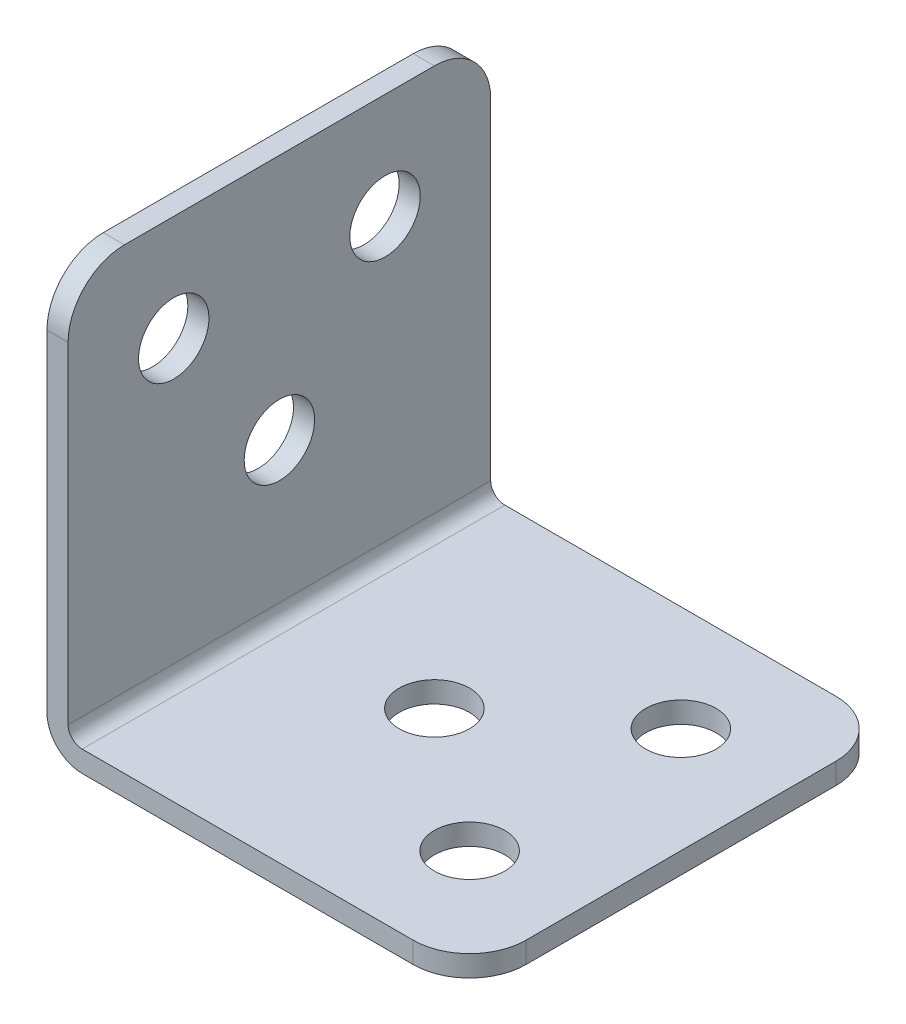
ISO-10303-21;
HEADER;
FILE_DESCRIPTION(('STEP AP214'),'2;1');
FILE_NAME('part.step','',(''),(''),'','','');
FILE_SCHEMA(('AUTOMOTIVE_DESIGN { 1 0 10303 214 1 1 1 1 }'));
ENDSEC;
DATA;
#1=APPLICATION_CONTEXT('core data for automotive mechanical design processes');
#2=APPLICATION_PROTOCOL_DEFINITION('international standard','automotive_design',2000,#1);
#3=PRODUCT_CONTEXT('',#1,'mechanical');
#4=PRODUCT('Part','Part','',(#3));
#5=PRODUCT_RELATED_PRODUCT_CATEGORY('part','',(#4));
#6=PRODUCT_DEFINITION_FORMATION('','',#4);
#7=PRODUCT_DEFINITION_CONTEXT('part definition',#1,'design');
#8=PRODUCT_DEFINITION('design','',#6,#7);
#9=PRODUCT_DEFINITION_SHAPE('','',#8);
#10=(LENGTH_UNIT() NAMED_UNIT(*) SI_UNIT(.MILLI.,.METRE.));
#11=(NAMED_UNIT(*) PLANE_ANGLE_UNIT() SI_UNIT($,.RADIAN.));
#12=(NAMED_UNIT(*) SI_UNIT($,.STERADIAN.) SOLID_ANGLE_UNIT());
#13=UNCERTAINTY_MEASURE_WITH_UNIT(LENGTH_MEASURE(1.E-05),#10,'distance_accuracy_value','');
#14=(GEOMETRIC_REPRESENTATION_CONTEXT(3) GLOBAL_UNCERTAINTY_ASSIGNED_CONTEXT((#13)) GLOBAL_UNIT_ASSIGNED_CONTEXT((#10,
#11,#12)) REPRESENTATION_CONTEXT('',''));
#15=CARTESIAN_POINT('',(0.,0.,0.));
#16=DIRECTION('',(0.,0.,1.));
#17=DIRECTION('',(1.,0.,0.));
#18=AXIS2_PLACEMENT_3D('',#15,#16,#17);
#19=CARTESIAN_POINT('',(-2.5,27.5,30.));
#20=DIRECTION('',(0.,-1.,0.));
#21=DIRECTION('',(0.,0.,-1.));
#22=AXIS2_PLACEMENT_3D('',#19,#20,#21);
#23=PLANE('',#22);
#24=DIRECTION('',(0.,0.,-1.));
#25=VECTOR('',#24,1.);
#26=CARTESIAN_POINT('',(-2.5,27.5,30.));
#27=LINE('',#26,#25);
#28=CARTESIAN_POINT('',(-2.5,27.5,26.));
#29=VERTEX_POINT('',#28);
#30=CARTESIAN_POINT('',(-2.5,27.5,4.));
#31=VERTEX_POINT('',#30);
#32=EDGE_CURVE('E144',#29,#31,#27,.T.);
#33=ORIENTED_EDGE('',*,*,#32,.F.);
#34=DIRECTION('',(-1.,0.,0.));
#35=VECTOR('',#34,1.);
#36=CARTESIAN_POINT('',(-1.,27.5,26.));
#37=LINE('',#36,#35);
#38=CARTESIAN_POINT('',(-1.,27.5,26.));
#39=VERTEX_POINT('',#38);
#40=EDGE_CURVE('E56',#29,#39,#37,.F.);
#41=ORIENTED_EDGE('',*,*,#40,.T.);
#42=DIRECTION('',(0.,0.,-1.));
#43=VECTOR('',#42,1.);
#44=CARTESIAN_POINT('',(-1.,27.5,30.));
#45=LINE('',#44,#43);
#46=CARTESIAN_POINT('',(-1.,27.5,4.));
#47=VERTEX_POINT('',#46);
#48=EDGE_CURVE('E161',#39,#47,#45,.T.);
#49=ORIENTED_EDGE('',*,*,#48,.T.);
#50=DIRECTION('',(-1.,0.,0.));
#51=VECTOR('',#50,1.);
#52=CARTESIAN_POINT('',(-2.5,27.5,4.));
#53=LINE('',#52,#51);
#54=EDGE_CURVE('E237',#47,#31,#53,.T.);
#55=ORIENTED_EDGE('',*,*,#54,.T.);
#56=EDGE_LOOP('',(#33,#41,#49,#55));
#57=FACE_BOUND('',#56,.T.);
#58=ADVANCED_FACE('F35',(#57),#23,.F.);
#59=CARTESIAN_POINT('',(-2.5,27.5,30.));
#60=DIRECTION('',(1.,0.,0.));
#61=DIRECTION('',(0.,1.,0.));
#62=AXIS2_PLACEMENT_3D('',#59,#60,#61);
#63=PLANE('',#62);
#64=CARTESIAN_POINT('',(-2.5,10.,15.));
#65=DIRECTION('',(-1.,0.,0.));
#66=DIRECTION('',(0.,-1.,0.));
#67=AXIS2_PLACEMENT_3D('',#64,#65,#66);
#68=CIRCLE('',#67,2.5);
#69=CARTESIAN_POINT('',(-2.5,7.5,15.));
#70=VERTEX_POINT('',#69);
#71=EDGE_CURVE('E198',#70,#70,#68,.T.);
#72=ORIENTED_EDGE('',*,*,#71,.F.);
#73=EDGE_LOOP('',(#72));
#74=FACE_BOUND('',#73,.T.);
#75=CARTESIAN_POINT('',(-2.5,20.,22.5));
#76=DIRECTION('',(-1.,0.,0.));
#77=DIRECTION('',(0.,1.,0.));
#78=AXIS2_PLACEMENT_3D('',#75,#76,#77);
#79=CIRCLE('',#78,2.50000000000001);
#80=CARTESIAN_POINT('',(-2.5,22.5,22.5));
#81=VERTEX_POINT('',#80);
#82=EDGE_CURVE('E204',#81,#81,#79,.T.);
#83=ORIENTED_EDGE('',*,*,#82,.F.);
#84=EDGE_LOOP('',(#83));
#85=FACE_BOUND('',#84,.T.);
#86=CARTESIAN_POINT('',(-2.5,20.,7.5));
#87=DIRECTION('',(-1.,0.,0.));
#88=DIRECTION('',(0.,-1.,0.));
#89=AXIS2_PLACEMENT_3D('',#86,#87,#88);
#90=CIRCLE('',#89,2.5);
#91=CARTESIAN_POINT('',(-2.5,17.5,7.5));
#92=VERTEX_POINT('',#91);
#93=EDGE_CURVE('E193',#92,#92,#90,.T.);
#94=ORIENTED_EDGE('',*,*,#93,.F.);
#95=EDGE_LOOP('',(#94));
#96=FACE_BOUND('',#95,.T.);
#97=DIRECTION('',(0.,-1.,0.));
#98=VECTOR('',#97,1.);
#99=CARTESIAN_POINT('',(-2.5,27.5,30.));
#100=LINE('',#99,#98);
#101=CARTESIAN_POINT('',(-2.5,23.5,30.));
#102=VERTEX_POINT('',#101);
#103=CARTESIAN_POINT('',(-2.5,0.,30.));
#104=VERTEX_POINT('',#103);
#105=EDGE_CURVE('E124',#102,#104,#100,.T.);
#106=ORIENTED_EDGE('',*,*,#105,.F.);
#107=CARTESIAN_POINT('',(-2.5,23.5,26.));
#108=DIRECTION('',(1.,0.,0.));
#109=DIRECTION('',(0.,1.,0.));
#110=AXIS2_PLACEMENT_3D('',#107,#108,#109);
#111=CIRCLE('',#110,4.);
#112=EDGE_CURVE('E235',#102,#29,#111,.F.);
#113=ORIENTED_EDGE('',*,*,#112,.T.);
#114=ORIENTED_EDGE('',*,*,#32,.T.);
#115=CARTESIAN_POINT('',(-2.5,23.5,4.));
#116=DIRECTION('',(1.,0.,0.));
#117=DIRECTION('',(0.,1.,0.));
#118=AXIS2_PLACEMENT_3D('',#115,#116,#117);
#119=CIRCLE('',#118,4.);
#120=CARTESIAN_POINT('',(-2.5,23.5,0.));
#121=VERTEX_POINT('',#120);
#122=EDGE_CURVE('E233',#31,#121,#119,.F.);
#123=ORIENTED_EDGE('',*,*,#122,.T.);
#124=DIRECTION('',(0.,-1.,0.));
#125=VECTOR('',#124,1.);
#126=CARTESIAN_POINT('',(-2.5,27.5,0.));
#127=LINE('',#126,#125);
#128=CARTESIAN_POINT('',(-2.5,0.,0.));
#129=VERTEX_POINT('',#128);
#130=EDGE_CURVE('E141',#121,#129,#127,.T.);
#131=ORIENTED_EDGE('',*,*,#130,.T.);
#132=DIRECTION('',(0.,0.,-1.));
#133=VECTOR('',#132,1.);
#134=CARTESIAN_POINT('',(-2.5,0.,30.));
#135=LINE('',#134,#133);
#136=EDGE_CURVE('E138',#104,#129,#135,.T.);
#137=ORIENTED_EDGE('',*,*,#136,.F.);
#138=EDGE_LOOP('',(#106,#113,#114,#123,#131,#137));
#139=FACE_BOUND('',#138,.T.);
#140=ADVANCED_FACE('F139',(#74,#85,#96,#139),#63,.F.);
#141=CARTESIAN_POINT('',(0.,0.,30.));
#142=DIRECTION('',(0.,0.,-1.));
#143=DIRECTION('',(-1.,0.,0.));
#144=AXIS2_PLACEMENT_3D('',#141,#142,#143);
#145=CYLINDRICAL_SURFACE('',#144,2.5);
#146=CARTESIAN_POINT('',(0.,0.,0.));
#147=DIRECTION('',(0.,0.,1.));
#148=DIRECTION('',(1.,0.,0.));
#149=AXIS2_PLACEMENT_3D('',#146,#147,#148);
#150=CIRCLE('',#149,2.5);
#151=CARTESIAN_POINT('',(0.,-2.5,0.));
#152=VERTEX_POINT('',#151);
#153=EDGE_CURVE('E163',#129,#152,#150,.T.);
#154=ORIENTED_EDGE('',*,*,#153,.T.);
#155=DIRECTION('',(0.,0.,-1.));
#156=VECTOR('',#155,1.);
#157=CARTESIAN_POINT('',(0.,-2.5,30.));
#158=LINE('',#157,#156);
#159=CARTESIAN_POINT('',(0.,-2.5,30.));
#160=VERTEX_POINT('',#159);
#161=EDGE_CURVE('E145',#160,#152,#158,.T.);
#162=ORIENTED_EDGE('',*,*,#161,.F.);
#163=CARTESIAN_POINT('',(0.,0.,30.));
#164=DIRECTION('',(0.,0.,1.));
#165=DIRECTION('',(1.,0.,0.));
#166=AXIS2_PLACEMENT_3D('',#163,#164,#165);
#167=CIRCLE('',#166,2.5);
#168=EDGE_CURVE('E129',#104,#160,#167,.T.);
#169=ORIENTED_EDGE('',*,*,#168,.F.);
#170=ORIENTED_EDGE('',*,*,#136,.T.);
#171=EDGE_LOOP('',(#154,#162,#169,#170));
#172=FACE_BOUND('',#171,.T.);
#173=ADVANCED_FACE('F147',(#172),#145,.T.);
#174=CARTESIAN_POINT('',(0.,-2.5,30.));
#175=DIRECTION('',(0.,1.,0.));
#176=DIRECTION('',(0.,0.,1.));
#177=AXIS2_PLACEMENT_3D('',#174,#175,#176);
#178=PLANE('',#177);
#179=CARTESIAN_POINT('',(20.,-2.5,22.5));
#180=DIRECTION('',(0.,-1.,0.));
#181=DIRECTION('',(-1.,0.,0.));
#182=AXIS2_PLACEMENT_3D('',#179,#180,#181);
#183=CIRCLE('',#182,2.5);
#184=CARTESIAN_POINT('',(17.5,-2.5,22.5));
#185=VERTEX_POINT('',#184);
#186=EDGE_CURVE('E210',#185,#185,#183,.T.);
#187=ORIENTED_EDGE('',*,*,#186,.F.);
#188=EDGE_LOOP('',(#187));
#189=FACE_BOUND('',#188,.T.);
#190=CARTESIAN_POINT('',(10.,-2.5,15.));
#191=DIRECTION('',(0.,-1.,0.));
#192=DIRECTION('',(1.,0.,0.));
#193=AXIS2_PLACEMENT_3D('',#190,#191,#192);
#194=CIRCLE('',#193,2.5);
#195=CARTESIAN_POINT('',(12.5,-2.5,15.));
#196=VERTEX_POINT('',#195);
#197=EDGE_CURVE('E457',#196,#196,#194,.T.);
#198=ORIENTED_EDGE('',*,*,#197,.F.);
#199=EDGE_LOOP('',(#198));
#200=FACE_BOUND('',#199,.T.);
#201=CARTESIAN_POINT('',(20.,-2.5,7.5));
#202=DIRECTION('',(0.,-1.,0.));
#203=DIRECTION('',(1.,0.,0.));
#204=AXIS2_PLACEMENT_3D('',#201,#202,#203);
#205=CIRCLE('',#204,2.5);
#206=CARTESIAN_POINT('',(22.5,-2.5,7.5));
#207=VERTEX_POINT('',#206);
#208=EDGE_CURVE('E205',#207,#207,#205,.T.);
#209=ORIENTED_EDGE('',*,*,#208,.F.);
#210=EDGE_LOOP('',(#209));
#211=FACE_BOUND('',#210,.T.);
#212=DIRECTION('',(1.,0.,0.));
#213=VECTOR('',#212,1.);
#214=CARTESIAN_POINT('',(0.,-2.5,0.));
#215=LINE('',#214,#213);
#216=CARTESIAN_POINT('',(23.5,-2.5,0.));
#217=VERTEX_POINT('',#216);
#218=EDGE_CURVE('E166',#152,#217,#215,.T.);
#219=ORIENTED_EDGE('',*,*,#218,.T.);
#220=CARTESIAN_POINT('',(23.5,-2.5,4.));
#221=DIRECTION('',(0.,1.,0.));
#222=DIRECTION('',(0.,0.,1.));
#223=AXIS2_PLACEMENT_3D('',#220,#221,#222);
#224=CIRCLE('',#223,4.);
#225=CARTESIAN_POINT('',(27.5,-2.5,4.));
#226=VERTEX_POINT('',#225);
#227=EDGE_CURVE('E227',#217,#226,#224,.F.);
#228=ORIENTED_EDGE('',*,*,#227,.T.);
#229=DIRECTION('',(0.,0.,-1.));
#230=VECTOR('',#229,1.);
#231=CARTESIAN_POINT('',(27.5,-2.5,30.));
#232=LINE('',#231,#230);
#233=CARTESIAN_POINT('',(27.5,-2.5,26.));
#234=VERTEX_POINT('',#233);
#235=EDGE_CURVE('E184',#234,#226,#232,.T.);
#236=ORIENTED_EDGE('',*,*,#235,.F.);
#237=CARTESIAN_POINT('',(23.5,-2.5,26.));
#238=DIRECTION('',(0.,1.,0.));
#239=DIRECTION('',(0.,0.,1.));
#240=AXIS2_PLACEMENT_3D('',#237,#238,#239);
#241=CIRCLE('',#240,4.);
#242=CARTESIAN_POINT('',(23.5,-2.5,30.));
#243=VERTEX_POINT('',#242);
#244=EDGE_CURVE('E225',#234,#243,#241,.F.);
#245=ORIENTED_EDGE('',*,*,#244,.T.);
#246=DIRECTION('',(1.,0.,0.));
#247=VECTOR('',#246,1.);
#248=CARTESIAN_POINT('',(0.,-2.5,30.));
#249=LINE('',#248,#247);
#250=EDGE_CURVE('E150',#160,#243,#249,.T.);
#251=ORIENTED_EDGE('',*,*,#250,.F.);
#252=ORIENTED_EDGE('',*,*,#161,.T.);
#253=EDGE_LOOP('',(#219,#228,#236,#245,#251,#252));
#254=FACE_BOUND('',#253,.T.);
#255=ADVANCED_FACE('F287',(#189,#200,#211,#254),#178,.F.);
#256=CARTESIAN_POINT('',(27.5,-1.,30.));
#257=DIRECTION('',(-1.,0.,0.));
#258=DIRECTION('',(0.,0.,1.));
#259=AXIS2_PLACEMENT_3D('',#256,#257,#258);
#260=PLANE('',#259);
#261=ORIENTED_EDGE('',*,*,#235,.T.);
#262=DIRECTION('',(0.,1.,0.));
#263=VECTOR('',#262,1.);
#264=CARTESIAN_POINT('',(27.5,-1.,4.));
#265=LINE('',#264,#263);
#266=CARTESIAN_POINT('',(27.5,-1.,4.));
#267=VERTEX_POINT('',#266);
#268=EDGE_CURVE('E214',#226,#267,#265,.T.);
#269=ORIENTED_EDGE('',*,*,#268,.T.);
#270=DIRECTION('',(0.,0.,-1.));
#271=VECTOR('',#270,1.);
#272=CARTESIAN_POINT('',(27.5,-1.,30.));
#273=LINE('',#272,#271);
#274=CARTESIAN_POINT('',(27.5,-1.,26.));
#275=VERTEX_POINT('',#274);
#276=EDGE_CURVE('E181',#275,#267,#273,.T.);
#277=ORIENTED_EDGE('',*,*,#276,.F.);
#278=DIRECTION('',(0.,1.,0.));
#279=VECTOR('',#278,1.);
#280=CARTESIAN_POINT('',(27.5,-2.5,26.));
#281=LINE('',#280,#279);
#282=EDGE_CURVE('E190',#275,#234,#281,.F.);
#283=ORIENTED_EDGE('',*,*,#282,.T.);
#284=EDGE_LOOP('',(#261,#269,#277,#283));
#285=FACE_BOUND('',#284,.T.);
#286=ADVANCED_FACE('F296',(#285),#260,.F.);
#287=CARTESIAN_POINT('',(0.,-1.,30.));
#288=DIRECTION('',(0.,-1.,0.));
#289=DIRECTION('',(1.,0.,0.));
#290=AXIS2_PLACEMENT_3D('',#287,#288,#289);
#291=PLANE('',#290);
#292=CARTESIAN_POINT('',(20.,-1.,22.5));
#293=DIRECTION('',(0.,-1.,0.));
#294=DIRECTION('',(1.,0.,0.));
#295=AXIS2_PLACEMENT_3D('',#292,#293,#294);
#296=CIRCLE('',#295,2.5);
#297=CARTESIAN_POINT('',(22.5,-1.,22.5));
#298=VERTEX_POINT('',#297);
#299=EDGE_CURVE('E209',#298,#298,#296,.T.);
#300=ORIENTED_EDGE('',*,*,#299,.T.);
#301=EDGE_LOOP('',(#300));
#302=FACE_BOUND('',#301,.T.);
#303=CARTESIAN_POINT('',(10.,-1.,15.));
#304=DIRECTION('',(0.,-1.,0.));
#305=DIRECTION('',(1.,0.,0.));
#306=AXIS2_PLACEMENT_3D('',#303,#304,#305);
#307=CIRCLE('',#306,2.5);
#308=CARTESIAN_POINT('',(12.5,-1.,15.));
#309=VERTEX_POINT('',#308);
#310=EDGE_CURVE('E206',#309,#309,#307,.T.);
#311=ORIENTED_EDGE('',*,*,#310,.T.);
#312=EDGE_LOOP('',(#311));
#313=FACE_BOUND('',#312,.T.);
#314=CARTESIAN_POINT('',(20.,-1.,7.5));
#315=DIRECTION('',(0.,-1.,0.));
#316=DIRECTION('',(1.,0.,0.));
#317=AXIS2_PLACEMENT_3D('',#314,#315,#316);
#318=CIRCLE('',#317,2.5);
#319=CARTESIAN_POINT('',(22.5,-1.,7.5));
#320=VERTEX_POINT('',#319);
#321=EDGE_CURVE('E201',#320,#320,#318,.T.);
#322=ORIENTED_EDGE('',*,*,#321,.T.);
#323=EDGE_LOOP('',(#322));
#324=FACE_BOUND('',#323,.T.);
#325=ORIENTED_EDGE('',*,*,#276,.T.);
#326=CARTESIAN_POINT('',(23.5,-1.,4.));
#327=DIRECTION('',(0.,-1.,0.));
#328=DIRECTION('',(1.,0.,0.));
#329=AXIS2_PLACEMENT_3D('',#326,#327,#328);
#330=CIRCLE('',#329,4.);
#331=CARTESIAN_POINT('',(23.5,-1.,0.));
#332=VERTEX_POINT('',#331);
#333=EDGE_CURVE('E219',#267,#332,#330,.F.);
#334=ORIENTED_EDGE('',*,*,#333,.T.);
#335=DIRECTION('',(-1.,0.,0.));
#336=VECTOR('',#335,1.);
#337=CARTESIAN_POINT('',(0.,-1.,0.));
#338=LINE('',#337,#336);
#339=CARTESIAN_POINT('',(0.,-1.,0.));
#340=VERTEX_POINT('',#339);
#341=EDGE_CURVE('E169',#332,#340,#338,.T.);
#342=ORIENTED_EDGE('',*,*,#341,.T.);
#343=DIRECTION('',(0.,0.,-1.));
#344=VECTOR('',#343,1.);
#345=CARTESIAN_POINT('',(0.,-1.,30.));
#346=LINE('',#345,#344);
#347=CARTESIAN_POINT('',(0.,-1.,30.));
#348=VERTEX_POINT('',#347);
#349=EDGE_CURVE('E178',#348,#340,#346,.T.);
#350=ORIENTED_EDGE('',*,*,#349,.F.);
#351=DIRECTION('',(-1.,0.,0.));
#352=VECTOR('',#351,1.);
#353=CARTESIAN_POINT('',(0.,-1.,30.));
#354=LINE('',#353,#352);
#355=CARTESIAN_POINT('',(23.5,-1.,30.));
#356=VERTEX_POINT('',#355);
#357=EDGE_CURVE('E152',#356,#348,#354,.T.);
#358=ORIENTED_EDGE('',*,*,#357,.F.);
#359=CARTESIAN_POINT('',(23.5,-1.,26.));
#360=DIRECTION('',(0.,-1.,0.));
#361=DIRECTION('',(1.,0.,0.));
#362=AXIS2_PLACEMENT_3D('',#359,#360,#361);
#363=CIRCLE('',#362,4.);
#364=EDGE_CURVE('E217',#356,#275,#363,.F.);
#365=ORIENTED_EDGE('',*,*,#364,.T.);
#366=EDGE_LOOP('',(#325,#334,#342,#350,#358,#365));
#367=FACE_BOUND('',#366,.T.);
#368=ADVANCED_FACE('F289',(#302,#313,#324,#367),#291,.F.);
#369=CARTESIAN_POINT('',(0.,0.,30.));
#370=DIRECTION('',(0.,0.,-1.));
#371=DIRECTION('',(-1.,0.,0.));
#372=AXIS2_PLACEMENT_3D('',#369,#370,#371);
#373=CYLINDRICAL_SURFACE('',#372,1.);
#374=CARTESIAN_POINT('',(0.,0.,0.));
#375=DIRECTION('',(0.,0.,-1.));
#376=DIRECTION('',(1.,0.,0.));
#377=AXIS2_PLACEMENT_3D('',#374,#375,#376);
#378=CIRCLE('',#377,1.);
#379=CARTESIAN_POINT('',(-1.,0.,0.));
#380=VERTEX_POINT('',#379);
#381=EDGE_CURVE('E171',#340,#380,#378,.T.);
#382=ORIENTED_EDGE('',*,*,#381,.T.);
#383=DIRECTION('',(0.,0.,-1.));
#384=VECTOR('',#383,1.);
#385=CARTESIAN_POINT('',(-1.,0.,30.));
#386=LINE('',#385,#384);
#387=CARTESIAN_POINT('',(-1.,0.,30.));
#388=VERTEX_POINT('',#387);
#389=EDGE_CURVE('E175',#388,#380,#386,.T.);
#390=ORIENTED_EDGE('',*,*,#389,.F.);
#391=CARTESIAN_POINT('',(0.,0.,30.));
#392=DIRECTION('',(0.,0.,-1.));
#393=DIRECTION('',(1.,0.,0.));
#394=AXIS2_PLACEMENT_3D('',#391,#392,#393);
#395=CIRCLE('',#394,1.);
#396=EDGE_CURVE('E157',#348,#388,#395,.T.);
#397=ORIENTED_EDGE('',*,*,#396,.F.);
#398=ORIENTED_EDGE('',*,*,#349,.T.);
#399=EDGE_LOOP('',(#382,#390,#397,#398));
#400=FACE_BOUND('',#399,.T.);
#401=ADVANCED_FACE('F252',(#400),#373,.F.);
#402=CARTESIAN_POINT('',(-1.,27.5,30.));
#403=DIRECTION('',(-1.,0.,0.));
#404=DIRECTION('',(0.,-1.,0.));
#405=AXIS2_PLACEMENT_3D('',#402,#403,#404);
#406=PLANE('',#405);
#407=CARTESIAN_POINT('',(-1.,10.,15.));
#408=DIRECTION('',(-1.,0.,0.));
#409=DIRECTION('',(0.,-1.,0.));
#410=AXIS2_PLACEMENT_3D('',#407,#408,#409);
#411=CIRCLE('',#410,2.5);
#412=CARTESIAN_POINT('',(-1.,7.5,15.));
#413=VERTEX_POINT('',#412);
#414=EDGE_CURVE('E197',#413,#413,#411,.T.);
#415=ORIENTED_EDGE('',*,*,#414,.T.);
#416=EDGE_LOOP('',(#415));
#417=FACE_BOUND('',#416,.T.);
#418=CARTESIAN_POINT('',(-1.,20.,22.5));
#419=DIRECTION('',(-1.,0.,0.));
#420=DIRECTION('',(0.,-1.,0.));
#421=AXIS2_PLACEMENT_3D('',#418,#419,#420);
#422=CIRCLE('',#421,2.50000000000001);
#423=CARTESIAN_POINT('',(-1.,17.5,22.5));
#424=VERTEX_POINT('',#423);
#425=EDGE_CURVE('E194',#424,#424,#422,.T.);
#426=ORIENTED_EDGE('',*,*,#425,.T.);
#427=EDGE_LOOP('',(#426));
#428=FACE_BOUND('',#427,.T.);
#429=CARTESIAN_POINT('',(-1.,20.,7.5));
#430=DIRECTION('',(-1.,0.,0.));
#431=DIRECTION('',(0.,-1.,0.));
#432=AXIS2_PLACEMENT_3D('',#429,#430,#431);
#433=CIRCLE('',#432,2.5);
#434=CARTESIAN_POINT('',(-1.,17.5,7.5));
#435=VERTEX_POINT('',#434);
#436=EDGE_CURVE('E164',#435,#435,#433,.T.);
#437=ORIENTED_EDGE('',*,*,#436,.T.);
#438=EDGE_LOOP('',(#437));
#439=FACE_BOUND('',#438,.T.);
#440=ORIENTED_EDGE('',*,*,#48,.F.);
#441=CARTESIAN_POINT('',(-1.,23.5,26.));
#442=DIRECTION('',(-1.,0.,0.));
#443=DIRECTION('',(0.,-1.,0.));
#444=AXIS2_PLACEMENT_3D('',#441,#442,#443);
#445=CIRCLE('',#444,4.);
#446=CARTESIAN_POINT('',(-1.,23.5,30.));
#447=VERTEX_POINT('',#446);
#448=EDGE_CURVE('E11',#39,#447,#445,.F.);
#449=ORIENTED_EDGE('',*,*,#448,.T.);
#450=DIRECTION('',(0.,1.,0.));
#451=VECTOR('',#450,1.);
#452=CARTESIAN_POINT('',(-1.,27.5,30.));
#453=LINE('',#452,#451);
#454=EDGE_CURVE('E159',#388,#447,#453,.T.);
#455=ORIENTED_EDGE('',*,*,#454,.F.);
#456=ORIENTED_EDGE('',*,*,#389,.T.);
#457=DIRECTION('',(0.,1.,0.));
#458=VECTOR('',#457,1.);
#459=CARTESIAN_POINT('',(-1.,27.5,0.));
#460=LINE('',#459,#458);
#461=CARTESIAN_POINT('',(-1.,23.5,0.));
#462=VERTEX_POINT('',#461);
#463=EDGE_CURVE('E135',#380,#462,#460,.T.);
#464=ORIENTED_EDGE('',*,*,#463,.T.);
#465=CARTESIAN_POINT('',(-1.,23.5,4.));
#466=DIRECTION('',(-1.,0.,0.));
#467=DIRECTION('',(0.,-1.,0.));
#468=AXIS2_PLACEMENT_3D('',#465,#466,#467);
#469=CIRCLE('',#468,4.);
#470=EDGE_CURVE('E43',#462,#47,#469,.F.);
#471=ORIENTED_EDGE('',*,*,#470,.T.);
#472=EDGE_LOOP('',(#440,#449,#455,#456,#464,#471));
#473=FACE_BOUND('',#472,.T.);
#474=ADVANCED_FACE('F246',(#417,#428,#439,#473),#406,.F.);
#475=CARTESIAN_POINT('',(0.,0.,30.));
#476=DIRECTION('',(0.,0.,1.));
#477=DIRECTION('',(1.,0.,0.));
#478=AXIS2_PLACEMENT_3D('',#475,#476,#477);
#479=PLANE('',#478);
#480=ORIENTED_EDGE('',*,*,#250,.T.);
#481=DIRECTION('',(0.,1.,0.));
#482=VECTOR('',#481,1.);
#483=CARTESIAN_POINT('',(23.5,-1.,30.));
#484=LINE('',#483,#482);
#485=EDGE_CURVE('E230',#243,#356,#484,.T.);
#486=ORIENTED_EDGE('',*,*,#485,.T.);
#487=ORIENTED_EDGE('',*,*,#357,.T.);
#488=ORIENTED_EDGE('',*,*,#396,.T.);
#489=ORIENTED_EDGE('',*,*,#454,.T.);
#490=DIRECTION('',(-1.,0.,0.));
#491=VECTOR('',#490,1.);
#492=CARTESIAN_POINT('',(-2.5,23.5,30.));
#493=LINE('',#492,#491);
#494=EDGE_CURVE('E133',#447,#102,#493,.T.);
#495=ORIENTED_EDGE('',*,*,#494,.T.);
#496=ORIENTED_EDGE('',*,*,#105,.T.);
#497=ORIENTED_EDGE('',*,*,#168,.T.);
#498=EDGE_LOOP('',(#480,#486,#487,#488,#489,#495,#496,#497));
#499=FACE_BOUND('',#498,.T.);
#500=ADVANCED_FACE('F127',(#499),#479,.T.);
#501=CARTESIAN_POINT('',(0.,0.,0.));
#502=DIRECTION('',(0.,0.,1.));
#503=DIRECTION('',(1.,0.,0.));
#504=AXIS2_PLACEMENT_3D('',#501,#502,#503);
#505=PLANE('',#504);
#506=ORIENTED_EDGE('',*,*,#341,.F.);
#507=DIRECTION('',(0.,1.,0.));
#508=VECTOR('',#507,1.);
#509=CARTESIAN_POINT('',(23.5,0.,0.));
#510=LINE('',#509,#508);
#511=EDGE_CURVE('E223',#332,#217,#510,.F.);
#512=ORIENTED_EDGE('',*,*,#511,.T.);
#513=ORIENTED_EDGE('',*,*,#218,.F.);
#514=ORIENTED_EDGE('',*,*,#153,.F.);
#515=ORIENTED_EDGE('',*,*,#130,.F.);
#516=DIRECTION('',(-1.,0.,0.));
#517=VECTOR('',#516,1.);
#518=CARTESIAN_POINT('',(0.,23.5,0.));
#519=LINE('',#518,#517);
#520=EDGE_CURVE('E221',#121,#462,#519,.F.);
#521=ORIENTED_EDGE('',*,*,#520,.T.);
#522=ORIENTED_EDGE('',*,*,#463,.F.);
#523=ORIENTED_EDGE('',*,*,#381,.F.);
#524=EDGE_LOOP('',(#506,#512,#513,#514,#515,#521,#522,#523));
#525=FACE_BOUND('',#524,.T.);
#526=ADVANCED_FACE('F257',(#525),#505,.F.);
#527=CARTESIAN_POINT('',(37.5,20.,7.5));
#528=DIRECTION('',(-1.,0.,0.));
#529=DIRECTION('',(0.,-1.,0.));
#530=AXIS2_PLACEMENT_3D('',#527,#528,#529);
#531=CYLINDRICAL_SURFACE('',#530,2.5);
#532=ORIENTED_EDGE('',*,*,#93,.T.);
#533=EDGE_LOOP('',(#532));
#534=FACE_BOUND('',#533,.T.);
#535=ORIENTED_EDGE('',*,*,#436,.F.);
#536=EDGE_LOOP('',(#535));
#537=FACE_BOUND('',#536,.T.);
#538=ADVANCED_FACE('F358',(#534,#537),#531,.F.);
#539=CARTESIAN_POINT('',(37.5,20.,22.5));
#540=DIRECTION('',(-1.,0.,0.));
#541=DIRECTION('',(0.,-1.,0.));
#542=AXIS2_PLACEMENT_3D('',#539,#540,#541);
#543=CYLINDRICAL_SURFACE('',#542,2.50000000000001);
#544=ORIENTED_EDGE('',*,*,#82,.T.);
#545=EDGE_LOOP('',(#544));
#546=FACE_BOUND('',#545,.T.);
#547=ORIENTED_EDGE('',*,*,#425,.F.);
#548=EDGE_LOOP('',(#547));
#549=FACE_BOUND('',#548,.T.);
#550=ADVANCED_FACE('F412',(#546,#549),#543,.F.);
#551=CARTESIAN_POINT('',(37.5,10.,15.));
#552=DIRECTION('',(-1.,0.,0.));
#553=DIRECTION('',(0.,-1.,0.));
#554=AXIS2_PLACEMENT_3D('',#551,#552,#553);
#555=CYLINDRICAL_SURFACE('',#554,2.5);
#556=ORIENTED_EDGE('',*,*,#71,.T.);
#557=EDGE_LOOP('',(#556));
#558=FACE_BOUND('',#557,.T.);
#559=ORIENTED_EDGE('',*,*,#414,.F.);
#560=EDGE_LOOP('',(#559));
#561=FACE_BOUND('',#560,.T.);
#562=ADVANCED_FACE('F404',(#558,#561),#555,.F.);
#563=CARTESIAN_POINT('',(20.,37.5,7.5));
#564=DIRECTION('',(0.,-1.,0.));
#565=DIRECTION('',(1.,0.,0.));
#566=AXIS2_PLACEMENT_3D('',#563,#564,#565);
#567=CYLINDRICAL_SURFACE('',#566,2.5);
#568=ORIENTED_EDGE('',*,*,#208,.T.);
#569=EDGE_LOOP('',(#568));
#570=FACE_BOUND('',#569,.T.);
#571=ORIENTED_EDGE('',*,*,#321,.F.);
#572=EDGE_LOOP('',(#571));
#573=FACE_BOUND('',#572,.T.);
#574=ADVANCED_FACE('F396',(#570,#573),#567,.F.);
#575=CARTESIAN_POINT('',(10.,37.5,15.));
#576=DIRECTION('',(0.,-1.,0.));
#577=DIRECTION('',(1.,0.,0.));
#578=AXIS2_PLACEMENT_3D('',#575,#576,#577);
#579=CYLINDRICAL_SURFACE('',#578,2.5);
#580=ORIENTED_EDGE('',*,*,#197,.T.);
#581=EDGE_LOOP('',(#580));
#582=FACE_BOUND('',#581,.T.);
#583=ORIENTED_EDGE('',*,*,#310,.F.);
#584=EDGE_LOOP('',(#583));
#585=FACE_BOUND('',#584,.T.);
#586=ADVANCED_FACE('F389',(#582,#585),#579,.F.);
#587=CARTESIAN_POINT('',(20.,37.5,22.5));
#588=DIRECTION('',(0.,-1.,0.));
#589=DIRECTION('',(1.,0.,0.));
#590=AXIS2_PLACEMENT_3D('',#587,#588,#589);
#591=CYLINDRICAL_SURFACE('',#590,2.5);
#592=ORIENTED_EDGE('',*,*,#186,.T.);
#593=EDGE_LOOP('',(#592));
#594=FACE_BOUND('',#593,.T.);
#595=ORIENTED_EDGE('',*,*,#299,.F.);
#596=EDGE_LOOP('',(#595));
#597=FACE_BOUND('',#596,.T.);
#598=ADVANCED_FACE('F276',(#594,#597),#591,.F.);
#599=CARTESIAN_POINT('',(23.5,-1.,4.));
#600=DIRECTION('',(0.,1.,0.));
#601=DIRECTION('',(0.,0.,1.));
#602=AXIS2_PLACEMENT_3D('',#599,#600,#601);
#603=CYLINDRICAL_SURFACE('',#602,4.);
#604=ORIENTED_EDGE('',*,*,#227,.F.);
#605=ORIENTED_EDGE('',*,*,#511,.F.);
#606=ORIENTED_EDGE('',*,*,#333,.F.);
#607=ORIENTED_EDGE('',*,*,#268,.F.);
#608=EDGE_LOOP('',(#604,#605,#606,#607));
#609=FACE_BOUND('',#608,.T.);
#610=ADVANCED_FACE('F273',(#609),#603,.T.);
#611=CARTESIAN_POINT('',(23.5,0.,26.));
#612=DIRECTION('',(0.,-1.,0.));
#613=DIRECTION('',(0.,0.,-1.));
#614=AXIS2_PLACEMENT_3D('',#611,#612,#613);
#615=CYLINDRICAL_SURFACE('',#614,4.);
#616=ORIENTED_EDGE('',*,*,#244,.F.);
#617=ORIENTED_EDGE('',*,*,#282,.F.);
#618=ORIENTED_EDGE('',*,*,#364,.F.);
#619=ORIENTED_EDGE('',*,*,#485,.F.);
#620=EDGE_LOOP('',(#616,#617,#618,#619));
#621=FACE_BOUND('',#620,.T.);
#622=ADVANCED_FACE('F263',(#621),#615,.T.);
#623=CARTESIAN_POINT('',(0.,23.5,26.));
#624=DIRECTION('',(1.,0.,0.));
#625=DIRECTION('',(0.,0.,-1.));
#626=AXIS2_PLACEMENT_3D('',#623,#624,#625);
#627=CYLINDRICAL_SURFACE('',#626,4.);
#628=ORIENTED_EDGE('',*,*,#448,.F.);
#629=ORIENTED_EDGE('',*,*,#40,.F.);
#630=ORIENTED_EDGE('',*,*,#112,.F.);
#631=ORIENTED_EDGE('',*,*,#494,.F.);
#632=EDGE_LOOP('',(#628,#629,#630,#631));
#633=FACE_BOUND('',#632,.T.);
#634=ADVANCED_FACE('F244',(#633),#627,.T.);
#635=CARTESIAN_POINT('',(-2.5,23.5,4.));
#636=DIRECTION('',(-1.,0.,0.));
#637=DIRECTION('',(0.,0.,1.));
#638=AXIS2_PLACEMENT_3D('',#635,#636,#637);
#639=CYLINDRICAL_SURFACE('',#638,4.);
#640=ORIENTED_EDGE('',*,*,#470,.F.);
#641=ORIENTED_EDGE('',*,*,#520,.F.);
#642=ORIENTED_EDGE('',*,*,#122,.F.);
#643=ORIENTED_EDGE('',*,*,#54,.F.);
#644=EDGE_LOOP('',(#640,#641,#642,#643));
#645=FACE_BOUND('',#644,.T.);
#646=ADVANCED_FACE('F37',(#645),#639,.T.);
#647=CLOSED_SHELL('',(#58,#140,#173,#255,#286,#368,#401,#474,#500,#526,#538,#550,#562,#574,#586,
#598,#610,#622,#634,#646));
#648=MANIFOLD_SOLID_BREP('B2',#647);
#649=ADVANCED_BREP_SHAPE_REPRESENTATION('',(#18,#648),#14);
#650=SHAPE_DEFINITION_REPRESENTATION(#9,#649);
ENDSEC;
END-ISO-10303-21;
